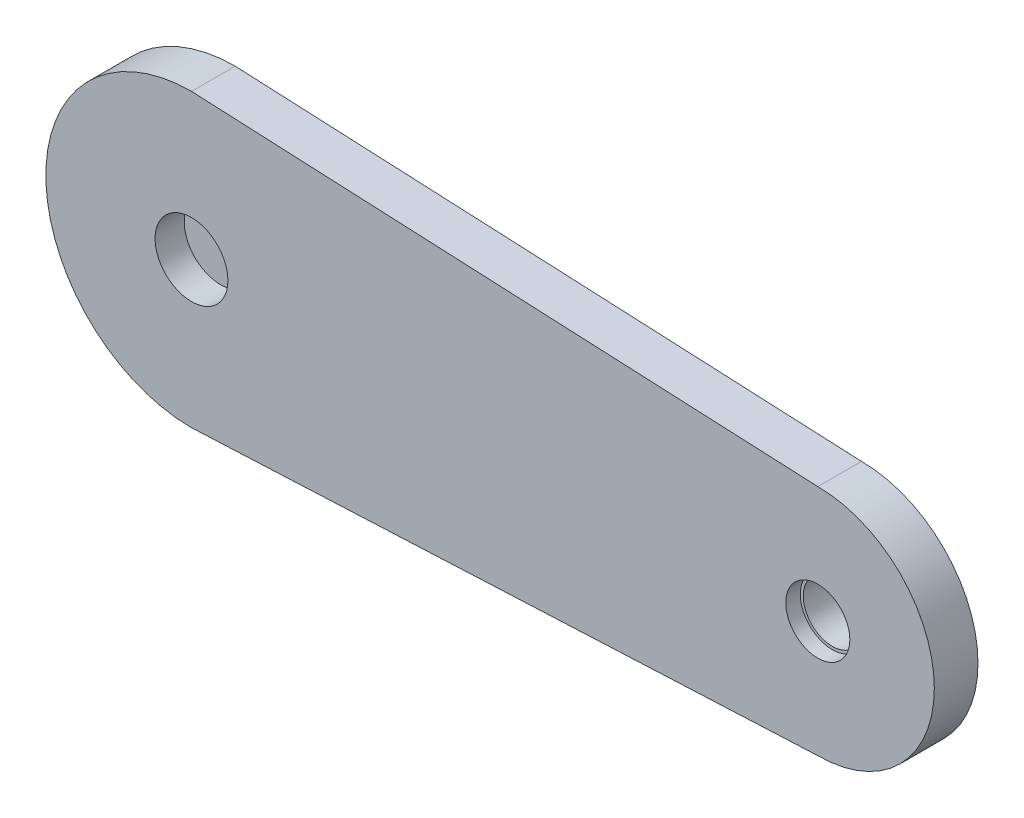
ISO-10303-21;
HEADER;
FILE_DESCRIPTION(('STEP AP214'),'2;1');
FILE_NAME('part.step','',(''),(''),'','','');
FILE_SCHEMA(('AUTOMOTIVE_DESIGN { 1 0 10303 214 1 1 1 1 }'));
ENDSEC;
DATA;
#1=APPLICATION_CONTEXT('core data for automotive mechanical design processes');
#2=APPLICATION_PROTOCOL_DEFINITION('international standard','automotive_design',2000,#1);
#3=PRODUCT_CONTEXT('',#1,'mechanical');
#4=PRODUCT('Part','Part','',(#3));
#5=PRODUCT_RELATED_PRODUCT_CATEGORY('part','',(#4));
#6=PRODUCT_DEFINITION_FORMATION('','',#4);
#7=PRODUCT_DEFINITION_CONTEXT('part definition',#1,'design');
#8=PRODUCT_DEFINITION('design','',#6,#7);
#9=PRODUCT_DEFINITION_SHAPE('','',#8);
#10=(LENGTH_UNIT() NAMED_UNIT(*) SI_UNIT(.MILLI.,.METRE.));
#11=(NAMED_UNIT(*) PLANE_ANGLE_UNIT() SI_UNIT($,.RADIAN.));
#12=(NAMED_UNIT(*) SI_UNIT($,.STERADIAN.) SOLID_ANGLE_UNIT());
#13=UNCERTAINTY_MEASURE_WITH_UNIT(LENGTH_MEASURE(1.E-05),#10,'distance_accuracy_value','');
#14=(GEOMETRIC_REPRESENTATION_CONTEXT(3) GLOBAL_UNCERTAINTY_ASSIGNED_CONTEXT((#13)) GLOBAL_UNIT_ASSIGNED_CONTEXT((#10,
#11,#12)) REPRESENTATION_CONTEXT('',''));
#15=CARTESIAN_POINT('',(0.,0.,0.));
#16=DIRECTION('',(0.,0.,1.));
#17=DIRECTION('',(1.,0.,0.));
#18=AXIS2_PLACEMENT_3D('',#15,#16,#17);
#19=CARTESIAN_POINT('',(215.,0.,15.));
#20=DIRECTION('',(0.,0.,-1.));
#21=DIRECTION('',(-1.,0.,0.));
#22=AXIS2_PLACEMENT_3D('',#19,#20,#21);
#23=CYLINDRICAL_SURFACE('',#22,10.);
#24=CARTESIAN_POINT('',(215.,0.,0.));
#25=DIRECTION('',(0.,0.,1.));
#26=DIRECTION('',(1.,0.,0.));
#27=AXIS2_PLACEMENT_3D('',#24,#25,#26);
#28=CIRCLE('',#27,10.);
#29=CARTESIAN_POINT('',(225.,0.,0.));
#30=VERTEX_POINT('',#29);
#31=EDGE_CURVE('E117',#30,#30,#28,.T.);
#32=ORIENTED_EDGE('',*,*,#31,.F.);
#33=EDGE_LOOP('',(#32));
#34=FACE_BOUND('',#33,.T.);
#35=CARTESIAN_POINT('',(215.,0.,10.));
#36=DIRECTION('',(0.,0.,1.));
#37=DIRECTION('',(1.,0.,0.));
#38=AXIS2_PLACEMENT_3D('',#35,#36,#37);
#39=CIRCLE('',#38,10.);
#40=CARTESIAN_POINT('',(225.,0.,10.));
#41=VERTEX_POINT('',#40);
#42=EDGE_CURVE('E44',#41,#41,#39,.T.);
#43=ORIENTED_EDGE('',*,*,#42,.T.);
#44=EDGE_LOOP('',(#43));
#45=FACE_BOUND('',#44,.T.);
#46=ADVANCED_FACE('F40',(#34,#45),#23,.F.);
#47=CARTESIAN_POINT('',(0.,0.,15.));
#48=DIRECTION('',(0.,0.,-1.));
#49=DIRECTION('',(-1.,0.,0.));
#50=AXIS2_PLACEMENT_3D('',#47,#48,#49);
#51=CYLINDRICAL_SURFACE('',#50,1.25);
#52=CARTESIAN_POINT('',(0.,0.,0.));
#53=DIRECTION('',(0.,0.,1.));
#54=DIRECTION('',(1.,0.,0.));
#55=AXIS2_PLACEMENT_3D('',#52,#53,#54);
#56=CIRCLE('',#55,1.25);
#57=CARTESIAN_POINT('',(1.25,0.,0.));
#58=VERTEX_POINT('',#57);
#59=EDGE_CURVE('E110',#58,#58,#56,.T.);
#60=ORIENTED_EDGE('',*,*,#59,.F.);
#61=EDGE_LOOP('',(#60));
#62=FACE_BOUND('',#61,.T.);
#63=CARTESIAN_POINT('',(0.,0.,5.));
#64=DIRECTION('',(0.,0.,1.));
#65=DIRECTION('',(1.,0.,0.));
#66=AXIS2_PLACEMENT_3D('',#63,#64,#65);
#67=CIRCLE('',#66,1.25);
#68=CARTESIAN_POINT('',(1.25,0.,5.));
#69=VERTEX_POINT('',#68);
#70=EDGE_CURVE('E115',#69,#69,#67,.T.);
#71=ORIENTED_EDGE('',*,*,#70,.T.);
#72=EDGE_LOOP('',(#71));
#73=FACE_BOUND('',#72,.T.);
#74=ADVANCED_FACE('F140',(#62,#73),#51,.F.);
#75=CARTESIAN_POINT('',(0.,0.,15.));
#76=DIRECTION('',(0.,0.,1.));
#77=DIRECTION('',(1.,0.,0.));
#78=AXIS2_PLACEMENT_3D('',#75,#76,#77);
#79=PLANE('',#78);
#80=CARTESIAN_POINT('',(215.,0.,15.));
#81=DIRECTION('',(0.,0.,1.));
#82=DIRECTION('',(1.,0.,0.));
#83=AXIS2_PLACEMENT_3D('',#80,#81,#82);
#84=CIRCLE('',#83,11.);
#85=CARTESIAN_POINT('',(226.,0.,15.));
#86=VERTEX_POINT('',#85);
#87=EDGE_CURVE('E131',#86,#86,#84,.T.);
#88=ORIENTED_EDGE('',*,*,#87,.F.);
#89=EDGE_LOOP('',(#88));
#90=FACE_BOUND('',#89,.T.);
#91=CARTESIAN_POINT('',(0.,0.,15.));
#92=DIRECTION('',(0.,0.,1.));
#93=DIRECTION('',(1.,0.,0.));
#94=AXIS2_PLACEMENT_3D('',#91,#92,#93);
#95=CIRCLE('',#94,12.5);
#96=CARTESIAN_POINT('',(12.5,0.,15.));
#97=VERTEX_POINT('',#96);
#98=EDGE_CURVE('E124',#97,#97,#95,.T.);
#99=ORIENTED_EDGE('',*,*,#98,.F.);
#100=EDGE_LOOP('',(#99));
#101=FACE_BOUND('',#100,.T.);
#102=CARTESIAN_POINT('',(0.,0.,15.));
#103=DIRECTION('',(0.,0.,1.));
#104=DIRECTION('',(1.,0.,0.));
#105=AXIS2_PLACEMENT_3D('',#102,#103,#104);
#106=CIRCLE('',#105,50.);
#107=CARTESIAN_POINT('',(0.,50.,15.));
#108=VERTEX_POINT('',#107);
#109=CARTESIAN_POINT('',(4.64112250404739,-49.7841338370211,15.));
#110=VERTEX_POINT('',#109);
#111=EDGE_CURVE('E94',#108,#110,#106,.T.);
#112=ORIENTED_EDGE('',*,*,#111,.T.);
#113=DIRECTION('',(0.998920086078066,0.0464613993524682,0.));
#114=VECTOR('',#113,1.);
#115=CARTESIAN_POINT('',(4.64112250404739,-49.7841338370211,15.));
#116=LINE('',#115,#114);
#117=CARTESIAN_POINT('',(215.,-40.,15.));
#118=VERTEX_POINT('',#117);
#119=EDGE_CURVE('E89',#110,#118,#116,.T.);
#120=ORIENTED_EDGE('',*,*,#119,.T.);
#121=CARTESIAN_POINT('',(215.,0.,15.));
#122=DIRECTION('',(0.,0.,1.));
#123=DIRECTION('',(1.,0.,0.));
#124=AXIS2_PLACEMENT_3D('',#121,#122,#123);
#125=CIRCLE('',#124,40.);
#126=CARTESIAN_POINT('',(215.,40.,15.));
#127=VERTEX_POINT('',#126);
#128=EDGE_CURVE('E92',#118,#127,#125,.T.);
#129=ORIENTED_EDGE('',*,*,#128,.T.);
#130=DIRECTION('',(-0.998920086078066,0.0464613993524682,0.));
#131=VECTOR('',#130,1.);
#132=CARTESIAN_POINT('',(0.,50.,15.));
#133=LINE('',#132,#131);
#134=EDGE_CURVE('E59',#127,#108,#133,.T.);
#135=ORIENTED_EDGE('',*,*,#134,.T.);
#136=EDGE_LOOP('',(#112,#120,#129,#135));
#137=FACE_BOUND('',#136,.T.);
#138=ADVANCED_FACE('F90',(#90,#101,#137),#79,.T.);
#139=CARTESIAN_POINT('',(0.,0.,0.));
#140=DIRECTION('',(0.,0.,1.));
#141=DIRECTION('',(1.,0.,0.));
#142=AXIS2_PLACEMENT_3D('',#139,#140,#141);
#143=PLANE('',#142);
#144=CARTESIAN_POINT('',(0.,0.,0.));
#145=DIRECTION('',(0.,0.,1.));
#146=DIRECTION('',(1.,0.,0.));
#147=AXIS2_PLACEMENT_3D('',#144,#145,#146);
#148=CIRCLE('',#147,50.);
#149=CARTESIAN_POINT('',(0.,50.,0.));
#150=VERTEX_POINT('',#149);
#151=CARTESIAN_POINT('',(4.64112250404739,-49.7841338370211,0.));
#152=VERTEX_POINT('',#151);
#153=EDGE_CURVE('E107',#150,#152,#148,.T.);
#154=ORIENTED_EDGE('',*,*,#153,.F.);
#155=DIRECTION('',(-0.998920086078066,0.0464613993524682,0.));
#156=VECTOR('',#155,1.);
#157=CARTESIAN_POINT('',(0.,50.,0.));
#158=LINE('',#157,#156);
#159=CARTESIAN_POINT('',(215.,40.,0.));
#160=VERTEX_POINT('',#159);
#161=EDGE_CURVE('E82',#160,#150,#158,.T.);
#162=ORIENTED_EDGE('',*,*,#161,.F.);
#163=CARTESIAN_POINT('',(215.,0.,0.));
#164=DIRECTION('',(0.,0.,1.));
#165=DIRECTION('',(1.,0.,0.));
#166=AXIS2_PLACEMENT_3D('',#163,#164,#165);
#167=CIRCLE('',#166,40.);
#168=CARTESIAN_POINT('',(215.,-40.,0.));
#169=VERTEX_POINT('',#168);
#170=EDGE_CURVE('E76',#169,#160,#167,.T.);
#171=ORIENTED_EDGE('',*,*,#170,.F.);
#172=DIRECTION('',(0.998920086078066,0.0464613993524682,0.));
#173=VECTOR('',#172,1.);
#174=CARTESIAN_POINT('',(4.64112250404739,-49.7841338370211,0.));
#175=LINE('',#174,#173);
#176=EDGE_CURVE('E98',#152,#169,#175,.T.);
#177=ORIENTED_EDGE('',*,*,#176,.F.);
#178=EDGE_LOOP('',(#154,#162,#171,#177));
#179=FACE_BOUND('',#178,.T.);
#180=ORIENTED_EDGE('',*,*,#59,.T.);
#181=EDGE_LOOP('',(#180));
#182=FACE_BOUND('',#181,.T.);
#183=ORIENTED_EDGE('',*,*,#31,.T.);
#184=EDGE_LOOP('',(#183));
#185=FACE_BOUND('',#184,.T.);
#186=ADVANCED_FACE('F137',(#179,#182,#185),#143,.F.);
#187=CARTESIAN_POINT('',(0.,0.,15.));
#188=DIRECTION('',(0.,0.,-1.));
#189=DIRECTION('',(-1.,0.,0.));
#190=AXIS2_PLACEMENT_3D('',#187,#188,#189);
#191=CYLINDRICAL_SURFACE('',#190,50.);
#192=ORIENTED_EDGE('',*,*,#153,.T.);
#193=DIRECTION('',(0.,0.,-1.));
#194=VECTOR('',#193,1.);
#195=CARTESIAN_POINT('',(4.64112250404739,-49.7841338370211,15.));
#196=LINE('',#195,#194);
#197=EDGE_CURVE('E11',#110,#152,#196,.T.);
#198=ORIENTED_EDGE('',*,*,#197,.F.);
#199=ORIENTED_EDGE('',*,*,#111,.F.);
#200=DIRECTION('',(0.,0.,-1.));
#201=VECTOR('',#200,1.);
#202=CARTESIAN_POINT('',(0.,50.,15.));
#203=LINE('',#202,#201);
#204=EDGE_CURVE('E103',#108,#150,#203,.T.);
#205=ORIENTED_EDGE('',*,*,#204,.T.);
#206=EDGE_LOOP('',(#192,#198,#199,#205));
#207=FACE_BOUND('',#206,.T.);
#208=ADVANCED_FACE('F42',(#207),#191,.T.);
#209=CARTESIAN_POINT('',(4.64112250404739,-49.7841338370211,15.));
#210=DIRECTION('',(-0.0464613993524682,0.998920086078066,0.));
#211=DIRECTION('',(-0.998920086078066,-0.0464613993524682,0.));
#212=AXIS2_PLACEMENT_3D('',#209,#210,#211);
#213=PLANE('',#212);
#214=ORIENTED_EDGE('',*,*,#176,.T.);
#215=DIRECTION('',(0.,0.,-1.));
#216=VECTOR('',#215,1.);
#217=CARTESIAN_POINT('',(215.,-40.,15.));
#218=LINE('',#217,#216);
#219=EDGE_CURVE('E50',#118,#169,#218,.T.);
#220=ORIENTED_EDGE('',*,*,#219,.F.);
#221=ORIENTED_EDGE('',*,*,#119,.F.);
#222=ORIENTED_EDGE('',*,*,#197,.T.);
#223=EDGE_LOOP('',(#214,#220,#221,#222));
#224=FACE_BOUND('',#223,.T.);
#225=ADVANCED_FACE('F97',(#224),#213,.F.);
#226=CARTESIAN_POINT('',(215.,0.,15.));
#227=DIRECTION('',(0.,0.,-1.));
#228=DIRECTION('',(-1.,0.,0.));
#229=AXIS2_PLACEMENT_3D('',#226,#227,#228);
#230=CYLINDRICAL_SURFACE('',#229,40.);
#231=ORIENTED_EDGE('',*,*,#170,.T.);
#232=DIRECTION('',(0.,0.,-1.));
#233=VECTOR('',#232,1.);
#234=CARTESIAN_POINT('',(215.,40.,15.));
#235=LINE('',#234,#233);
#236=EDGE_CURVE('E99',#127,#160,#235,.T.);
#237=ORIENTED_EDGE('',*,*,#236,.F.);
#238=ORIENTED_EDGE('',*,*,#128,.F.);
#239=ORIENTED_EDGE('',*,*,#219,.T.);
#240=EDGE_LOOP('',(#231,#237,#238,#239));
#241=FACE_BOUND('',#240,.T.);
#242=ADVANCED_FACE('F101',(#241),#230,.T.);
#243=CARTESIAN_POINT('',(0.,50.,15.));
#244=DIRECTION('',(-0.0464613993524682,-0.998920086078066,0.));
#245=DIRECTION('',(0.998920086078066,-0.0464613993524682,0.));
#246=AXIS2_PLACEMENT_3D('',#243,#244,#245);
#247=PLANE('',#246);
#248=ORIENTED_EDGE('',*,*,#161,.T.);
#249=ORIENTED_EDGE('',*,*,#204,.F.);
#250=ORIENTED_EDGE('',*,*,#134,.F.);
#251=ORIENTED_EDGE('',*,*,#236,.T.);
#252=EDGE_LOOP('',(#248,#249,#250,#251));
#253=FACE_BOUND('',#252,.T.);
#254=ADVANCED_FACE('F156',(#253),#247,.F.);
#255=CARTESIAN_POINT('',(0.,0.,5.));
#256=DIRECTION('',(0.,0.,1.));
#257=DIRECTION('',(1.,0.,0.));
#258=AXIS2_PLACEMENT_3D('',#255,#256,#257);
#259=CYLINDRICAL_SURFACE('',#258,12.5);
#260=CARTESIAN_POINT('',(0.,0.,5.));
#261=DIRECTION('',(0.,0.,1.));
#262=DIRECTION('',(1.,0.,0.));
#263=AXIS2_PLACEMENT_3D('',#260,#261,#262);
#264=CIRCLE('',#263,12.5);
#265=CARTESIAN_POINT('',(12.5,0.,5.));
#266=VERTEX_POINT('',#265);
#267=EDGE_CURVE('E118',#266,#266,#264,.T.);
#268=ORIENTED_EDGE('',*,*,#267,.F.);
#269=EDGE_LOOP('',(#268));
#270=FACE_BOUND('',#269,.T.);
#271=ORIENTED_EDGE('',*,*,#98,.T.);
#272=EDGE_LOOP('',(#271));
#273=FACE_BOUND('',#272,.T.);
#274=ADVANCED_FACE('F159',(#270,#273),#259,.F.);
#275=CARTESIAN_POINT('',(0.,0.,5.));
#276=DIRECTION('',(0.,0.,1.));
#277=DIRECTION('',(1.,0.,0.));
#278=AXIS2_PLACEMENT_3D('',#275,#276,#277);
#279=PLANE('',#278);
#280=ORIENTED_EDGE('',*,*,#70,.F.);
#281=EDGE_LOOP('',(#280));
#282=FACE_BOUND('',#281,.T.);
#283=ORIENTED_EDGE('',*,*,#267,.T.);
#284=EDGE_LOOP('',(#283));
#285=FACE_BOUND('',#284,.T.);
#286=ADVANCED_FACE('F193',(#282,#285),#279,.T.);
#287=CARTESIAN_POINT('',(215.,0.,10.));
#288=DIRECTION('',(0.,0.,1.));
#289=DIRECTION('',(1.,0.,0.));
#290=AXIS2_PLACEMENT_3D('',#287,#288,#289);
#291=CYLINDRICAL_SURFACE('',#290,11.);
#292=CARTESIAN_POINT('',(215.,0.,10.));
#293=DIRECTION('',(0.,0.,1.));
#294=DIRECTION('',(1.,0.,0.));
#295=AXIS2_PLACEMENT_3D('',#292,#293,#294);
#296=CIRCLE('',#295,11.);
#297=CARTESIAN_POINT('',(226.,0.,10.));
#298=VERTEX_POINT('',#297);
#299=EDGE_CURVE('E280',#298,#298,#296,.T.);
#300=ORIENTED_EDGE('',*,*,#299,.F.);
#301=EDGE_LOOP('',(#300));
#302=FACE_BOUND('',#301,.T.);
#303=ORIENTED_EDGE('',*,*,#87,.T.);
#304=EDGE_LOOP('',(#303));
#305=FACE_BOUND('',#304,.T.);
#306=ADVANCED_FACE('F187',(#302,#305),#291,.F.);
#307=CARTESIAN_POINT('',(215.,0.,10.));
#308=DIRECTION('',(0.,0.,1.));
#309=DIRECTION('',(1.,0.,0.));
#310=AXIS2_PLACEMENT_3D('',#307,#308,#309);
#311=PLANE('',#310);
#312=ORIENTED_EDGE('',*,*,#42,.F.);
#313=EDGE_LOOP('',(#312));
#314=FACE_BOUND('',#313,.T.);
#315=ORIENTED_EDGE('',*,*,#299,.T.);
#316=EDGE_LOOP('',(#315));
#317=FACE_BOUND('',#316,.T.);
#318=ADVANCED_FACE('F192',(#314,#317),#311,.T.);
#319=CLOSED_SHELL('',(#46,#74,#138,#186,#208,#225,#242,#254,#274,#286,#306,#318));
#320=MANIFOLD_SOLID_BREP('B2',#319);
#321=ADVANCED_BREP_SHAPE_REPRESENTATION('',(#18,#320),#14);
#322=SHAPE_DEFINITION_REPRESENTATION(#9,#321);
ENDSEC;
END-ISO-10303-21;
